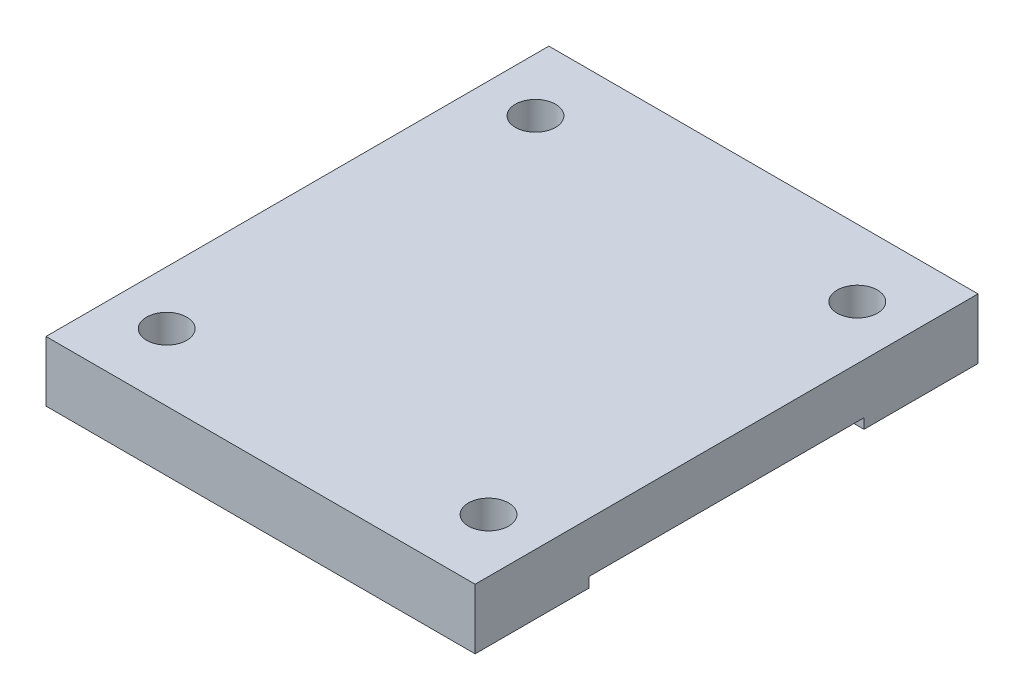
ISO-10303-21;
HEADER;
FILE_DESCRIPTION(('STEP AP214'),'2;1');
FILE_NAME('part.step','',(''),(''),'','','');
FILE_SCHEMA(('AUTOMOTIVE_DESIGN { 1 0 10303 214 1 1 1 1 }'));
ENDSEC;
DATA;
#1=APPLICATION_CONTEXT('core data for automotive mechanical design processes');
#2=APPLICATION_PROTOCOL_DEFINITION('international standard','automotive_design',2000,#1);
#3=PRODUCT_CONTEXT('',#1,'mechanical');
#4=PRODUCT('Part','Part','',(#3));
#5=PRODUCT_RELATED_PRODUCT_CATEGORY('part','',(#4));
#6=PRODUCT_DEFINITION_FORMATION('','',#4);
#7=PRODUCT_DEFINITION_CONTEXT('part definition',#1,'design');
#8=PRODUCT_DEFINITION('design','',#6,#7);
#9=PRODUCT_DEFINITION_SHAPE('','',#8);
#10=(LENGTH_UNIT() NAMED_UNIT(*) SI_UNIT(.MILLI.,.METRE.));
#11=(NAMED_UNIT(*) PLANE_ANGLE_UNIT() SI_UNIT($,.RADIAN.));
#12=(NAMED_UNIT(*) SI_UNIT($,.STERADIAN.) SOLID_ANGLE_UNIT());
#13=UNCERTAINTY_MEASURE_WITH_UNIT(LENGTH_MEASURE(1.E-05),#10,'distance_accuracy_value','');
#14=(GEOMETRIC_REPRESENTATION_CONTEXT(3) GLOBAL_UNCERTAINTY_ASSIGNED_CONTEXT((#13)) GLOBAL_UNIT_ASSIGNED_CONTEXT((#10,
#11,#12)) REPRESENTATION_CONTEXT('',''));
#15=CARTESIAN_POINT('',(0.,0.,0.));
#16=DIRECTION('',(0.,0.,1.));
#17=DIRECTION('',(1.,0.,0.));
#18=AXIS2_PLACEMENT_3D('',#15,#16,#17);
#19=CARTESIAN_POINT('',(0.,0.,37.5));
#20=DIRECTION('',(0.,1.,0.));
#21=DIRECTION('',(0.,0.,1.));
#22=AXIS2_PLACEMENT_3D('',#19,#20,#21);
#23=PLANE('',#22);
#24=CARTESIAN_POINT('',(7.99999999999995,0.,27.5));
#25=DIRECTION('',(0.,1.,0.));
#26=DIRECTION('',(0.,0.,1.));
#27=AXIS2_PLACEMENT_3D('',#24,#25,#26);
#28=CIRCLE('',#27,3.);
#29=CARTESIAN_POINT('',(7.99999999999995,0.,30.5));
#30=VERTEX_POINT('',#29);
#31=EDGE_CURVE('E189',#30,#30,#28,.T.);
#32=ORIENTED_EDGE('',*,*,#31,.T.);
#33=EDGE_LOOP('',(#32));
#34=FACE_BOUND('',#33,.T.);
#35=CARTESIAN_POINT('',(55.9999999999999,0.,27.5));
#36=DIRECTION('',(0.,1.,0.));
#37=DIRECTION('',(0.,0.,1.));
#38=AXIS2_PLACEMENT_3D('',#35,#36,#37);
#39=CIRCLE('',#38,3.);
#40=CARTESIAN_POINT('',(55.9999999999999,0.,30.5));
#41=VERTEX_POINT('',#40);
#42=EDGE_CURVE('E164',#41,#41,#39,.T.);
#43=ORIENTED_EDGE('',*,*,#42,.T.);
#44=EDGE_LOOP('',(#43));
#45=FACE_BOUND('',#44,.T.);
#46=DIRECTION('',(0.,0.,1.));
#47=VECTOR('',#46,1.);
#48=CARTESIAN_POINT('',(0.,0.,-37.5));
#49=LINE('',#48,#47);
#50=CARTESIAN_POINT('',(0.,0.,20.5));
#51=VERTEX_POINT('',#50);
#52=CARTESIAN_POINT('',(0.,0.,37.5));
#53=VERTEX_POINT('',#52);
#54=EDGE_CURVE('E141',#51,#53,#49,.T.);
#55=ORIENTED_EDGE('',*,*,#54,.F.);
#56=DIRECTION('',(-1.,0.,0.));
#57=VECTOR('',#56,1.);
#58=CARTESIAN_POINT('',(0.,0.,20.5));
#59=LINE('',#58,#57);
#60=CARTESIAN_POINT('',(64.,0.,20.5));
#61=VERTEX_POINT('',#60);
#62=EDGE_CURVE('E121',#61,#51,#59,.T.);
#63=ORIENTED_EDGE('',*,*,#62,.F.);
#64=DIRECTION('',(0.,0.,-1.));
#65=VECTOR('',#64,1.);
#66=CARTESIAN_POINT('',(64.,0.,-37.5));
#67=LINE('',#66,#65);
#68=CARTESIAN_POINT('',(64.,0.,37.5));
#69=VERTEX_POINT('',#68);
#70=EDGE_CURVE('E144',#69,#61,#67,.T.);
#71=ORIENTED_EDGE('',*,*,#70,.F.);
#72=DIRECTION('',(1.,0.,0.));
#73=VECTOR('',#72,1.);
#74=CARTESIAN_POINT('',(0.,0.,37.5));
#75=LINE('',#74,#73);
#76=EDGE_CURVE('E140',#53,#69,#75,.T.);
#77=ORIENTED_EDGE('',*,*,#76,.F.);
#78=EDGE_LOOP('',(#55,#63,#71,#77));
#79=FACE_BOUND('',#78,.T.);
#80=ADVANCED_FACE('F32',(#34,#45,#79),#23,.F.);
#81=CARTESIAN_POINT('',(0.,9.,-37.5));
#82=DIRECTION('',(1.,0.,0.));
#83=DIRECTION('',(0.,0.,-1.));
#84=AXIS2_PLACEMENT_3D('',#81,#82,#83);
#85=PLANE('',#84);
#86=DIRECTION('',(0.,0.,-1.));
#87=VECTOR('',#86,1.);
#88=CARTESIAN_POINT('',(0.,1.5,20.5));
#89=LINE('',#88,#87);
#90=CARTESIAN_POINT('',(0.,1.5,20.5));
#91=VERTEX_POINT('',#90);
#92=CARTESIAN_POINT('',(0.,1.5,-20.5));
#93=VERTEX_POINT('',#92);
#94=EDGE_CURVE('E112',#91,#93,#89,.T.);
#95=ORIENTED_EDGE('',*,*,#94,.F.);
#96=DIRECTION('',(0.,-1.,0.));
#97=VECTOR('',#96,1.);
#98=CARTESIAN_POINT('',(0.,1.5,20.5));
#99=LINE('',#98,#97);
#100=EDGE_CURVE('E167',#91,#51,#99,.T.);
#101=ORIENTED_EDGE('',*,*,#100,.T.);
#102=ORIENTED_EDGE('',*,*,#54,.T.);
#103=DIRECTION('',(0.,-1.,0.));
#104=VECTOR('',#103,1.);
#105=CARTESIAN_POINT('',(0.,9.,37.5));
#106=LINE('',#105,#104);
#107=CARTESIAN_POINT('',(0.,9.,37.5));
#108=VERTEX_POINT('',#107);
#109=EDGE_CURVE('E11',#108,#53,#106,.T.);
#110=ORIENTED_EDGE('',*,*,#109,.F.);
#111=DIRECTION('',(0.,0.,1.));
#112=VECTOR('',#111,1.);
#113=CARTESIAN_POINT('',(0.,9.,-37.5));
#114=LINE('',#113,#112);
#115=CARTESIAN_POINT('',(0.,9.,-37.5));
#116=VERTEX_POINT('',#115);
#117=EDGE_CURVE('E132',#116,#108,#114,.T.);
#118=ORIENTED_EDGE('',*,*,#117,.F.);
#119=DIRECTION('',(0.,-1.,0.));
#120=VECTOR('',#119,1.);
#121=CARTESIAN_POINT('',(0.,9.,-37.5));
#122=LINE('',#121,#120);
#123=CARTESIAN_POINT('',(0.,0.,-37.5));
#124=VERTEX_POINT('',#123);
#125=EDGE_CURVE('E138',#116,#124,#122,.T.);
#126=ORIENTED_EDGE('',*,*,#125,.T.);
#127=CARTESIAN_POINT('',(0.,0.,-20.5));
#128=VERTEX_POINT('',#127);
#129=EDGE_CURVE('E125',#124,#128,#49,.T.);
#130=ORIENTED_EDGE('',*,*,#129,.T.);
#131=DIRECTION('',(0.,-1.,0.));
#132=VECTOR('',#131,1.);
#133=CARTESIAN_POINT('',(0.,1.5,-20.5));
#134=LINE('',#133,#132);
#135=EDGE_CURVE('E47',#93,#128,#134,.T.);
#136=ORIENTED_EDGE('',*,*,#135,.F.);
#137=EDGE_LOOP('',(#95,#101,#102,#110,#118,#126,#130,#136));
#138=FACE_BOUND('',#137,.T.);
#139=ADVANCED_FACE('F34',(#138),#85,.F.);
#140=CARTESIAN_POINT('',(0.,9.,37.5));
#141=DIRECTION('',(0.,0.,-1.));
#142=DIRECTION('',(-1.,0.,0.));
#143=AXIS2_PLACEMENT_3D('',#140,#141,#142);
#144=PLANE('',#143);
#145=ORIENTED_EDGE('',*,*,#76,.T.);
#146=DIRECTION('',(0.,-1.,0.));
#147=VECTOR('',#146,1.);
#148=CARTESIAN_POINT('',(64.,9.,37.5));
#149=LINE('',#148,#147);
#150=CARTESIAN_POINT('',(64.,9.,37.5));
#151=VERTEX_POINT('',#150);
#152=EDGE_CURVE('E40',#151,#69,#149,.T.);
#153=ORIENTED_EDGE('',*,*,#152,.F.);
#154=DIRECTION('',(1.,0.,0.));
#155=VECTOR('',#154,1.);
#156=CARTESIAN_POINT('',(0.,9.,37.5));
#157=LINE('',#156,#155);
#158=EDGE_CURVE('E84',#108,#151,#157,.T.);
#159=ORIENTED_EDGE('',*,*,#158,.F.);
#160=ORIENTED_EDGE('',*,*,#109,.T.);
#161=EDGE_LOOP('',(#145,#153,#159,#160));
#162=FACE_BOUND('',#161,.T.);
#163=ADVANCED_FACE('F211',(#162),#144,.F.);
#164=CARTESIAN_POINT('',(64.,9.,-37.5));
#165=DIRECTION('',(-1.,0.,0.));
#166=DIRECTION('',(0.,0.,1.));
#167=AXIS2_PLACEMENT_3D('',#164,#165,#166);
#168=PLANE('',#167);
#169=ORIENTED_EDGE('',*,*,#70,.T.);
#170=DIRECTION('',(0.,-1.,0.));
#171=VECTOR('',#170,1.);
#172=CARTESIAN_POINT('',(64.,1.5,20.5));
#173=LINE('',#172,#171);
#174=CARTESIAN_POINT('',(64.,1.5,20.5));
#175=VERTEX_POINT('',#174);
#176=EDGE_CURVE('E127',#175,#61,#173,.T.);
#177=ORIENTED_EDGE('',*,*,#176,.F.);
#178=DIRECTION('',(0.,0.,1.));
#179=VECTOR('',#178,1.);
#180=CARTESIAN_POINT('',(64.,1.5,20.5));
#181=LINE('',#180,#179);
#182=CARTESIAN_POINT('',(64.,1.5,-20.5));
#183=VERTEX_POINT('',#182);
#184=EDGE_CURVE('E111',#183,#175,#181,.T.);
#185=ORIENTED_EDGE('',*,*,#184,.F.);
#186=DIRECTION('',(0.,-1.,0.));
#187=VECTOR('',#186,1.);
#188=CARTESIAN_POINT('',(64.,1.5,-20.5));
#189=LINE('',#188,#187);
#190=CARTESIAN_POINT('',(64.,0.,-20.5));
#191=VERTEX_POINT('',#190);
#192=EDGE_CURVE('E108',#183,#191,#189,.T.);
#193=ORIENTED_EDGE('',*,*,#192,.T.);
#194=CARTESIAN_POINT('',(64.,0.,-37.5));
#195=VERTEX_POINT('',#194);
#196=EDGE_CURVE('E143',#191,#195,#67,.T.);
#197=ORIENTED_EDGE('',*,*,#196,.T.);
#198=DIRECTION('',(0.,-1.,0.));
#199=VECTOR('',#198,1.);
#200=CARTESIAN_POINT('',(64.,9.,-37.5));
#201=LINE('',#200,#199);
#202=CARTESIAN_POINT('',(64.,9.,-37.5));
#203=VERTEX_POINT('',#202);
#204=EDGE_CURVE('E149',#203,#195,#201,.T.);
#205=ORIENTED_EDGE('',*,*,#204,.F.);
#206=DIRECTION('',(0.,0.,-1.));
#207=VECTOR('',#206,1.);
#208=CARTESIAN_POINT('',(64.,9.,-37.5));
#209=LINE('',#208,#207);
#210=EDGE_CURVE('E135',#151,#203,#209,.T.);
#211=ORIENTED_EDGE('',*,*,#210,.F.);
#212=ORIENTED_EDGE('',*,*,#152,.T.);
#213=EDGE_LOOP('',(#169,#177,#185,#193,#197,#205,#211,#212));
#214=FACE_BOUND('',#213,.T.);
#215=ADVANCED_FACE('F154',(#214),#168,.F.);
#216=CARTESIAN_POINT('',(0.,9.,-37.5));
#217=DIRECTION('',(0.,0.,1.));
#218=DIRECTION('',(1.,0.,0.));
#219=AXIS2_PLACEMENT_3D('',#216,#217,#218);
#220=PLANE('',#219);
#221=DIRECTION('',(-1.,0.,0.));
#222=VECTOR('',#221,1.);
#223=CARTESIAN_POINT('',(0.,0.,-37.5));
#224=LINE('',#223,#222);
#225=EDGE_CURVE('E77',#195,#124,#224,.T.);
#226=ORIENTED_EDGE('',*,*,#225,.T.);
#227=ORIENTED_EDGE('',*,*,#125,.F.);
#228=DIRECTION('',(-1.,0.,0.));
#229=VECTOR('',#228,1.);
#230=CARTESIAN_POINT('',(0.,9.,-37.5));
#231=LINE('',#230,#229);
#232=EDGE_CURVE('E56',#203,#116,#231,.T.);
#233=ORIENTED_EDGE('',*,*,#232,.F.);
#234=ORIENTED_EDGE('',*,*,#204,.T.);
#235=EDGE_LOOP('',(#226,#227,#233,#234));
#236=FACE_BOUND('',#235,.T.);
#237=ADVANCED_FACE('F202',(#236),#220,.F.);
#238=CARTESIAN_POINT('',(0.,9.,37.5));
#239=DIRECTION('',(0.,1.,0.));
#240=DIRECTION('',(0.,0.,1.));
#241=AXIS2_PLACEMENT_3D('',#238,#239,#240);
#242=PLANE('',#241);
#243=CARTESIAN_POINT('',(7.99999999999995,9.,27.5));
#244=DIRECTION('',(0.,1.,0.));
#245=DIRECTION('',(0.,0.,1.));
#246=AXIS2_PLACEMENT_3D('',#243,#244,#245);
#247=CIRCLE('',#246,2.99999999999999);
#248=CARTESIAN_POINT('',(7.99999999999995,9.,30.5));
#249=VERTEX_POINT('',#248);
#250=EDGE_CURVE('E192',#249,#249,#247,.T.);
#251=ORIENTED_EDGE('',*,*,#250,.F.);
#252=EDGE_LOOP('',(#251));
#253=FACE_BOUND('',#252,.T.);
#254=CARTESIAN_POINT('',(7.99999999999995,9.,-27.5));
#255=DIRECTION('',(0.,1.,0.));
#256=DIRECTION('',(0.,0.,1.));
#257=AXIS2_PLACEMENT_3D('',#254,#255,#256);
#258=CIRCLE('',#257,2.99999999999999);
#259=CARTESIAN_POINT('',(7.99999999999995,9.,-24.5));
#260=VERTEX_POINT('',#259);
#261=EDGE_CURVE('E186',#260,#260,#258,.T.);
#262=ORIENTED_EDGE('',*,*,#261,.F.);
#263=EDGE_LOOP('',(#262));
#264=FACE_BOUND('',#263,.T.);
#265=CARTESIAN_POINT('',(55.9999999999999,9.,-27.5));
#266=DIRECTION('',(0.,1.,0.));
#267=DIRECTION('',(0.,0.,1.));
#268=AXIS2_PLACEMENT_3D('',#265,#266,#267);
#269=CIRCLE('',#268,2.99999999999999);
#270=CARTESIAN_POINT('',(55.9999999999999,9.,-24.5000000000001));
#271=VERTEX_POINT('',#270);
#272=EDGE_CURVE('E180',#271,#271,#269,.T.);
#273=ORIENTED_EDGE('',*,*,#272,.F.);
#274=EDGE_LOOP('',(#273));
#275=FACE_BOUND('',#274,.T.);
#276=CARTESIAN_POINT('',(55.9999999999999,9.,27.5));
#277=DIRECTION('',(0.,1.,0.));
#278=DIRECTION('',(0.,0.,1.));
#279=AXIS2_PLACEMENT_3D('',#276,#277,#278);
#280=CIRCLE('',#279,2.99999999999999);
#281=CARTESIAN_POINT('',(55.9999999999999,9.,30.5));
#282=VERTEX_POINT('',#281);
#283=EDGE_CURVE('E174',#282,#282,#280,.T.);
#284=ORIENTED_EDGE('',*,*,#283,.F.);
#285=EDGE_LOOP('',(#284));
#286=FACE_BOUND('',#285,.T.);
#287=ORIENTED_EDGE('',*,*,#117,.T.);
#288=ORIENTED_EDGE('',*,*,#158,.T.);
#289=ORIENTED_EDGE('',*,*,#210,.T.);
#290=ORIENTED_EDGE('',*,*,#232,.T.);
#291=EDGE_LOOP('',(#287,#288,#289,#290));
#292=FACE_BOUND('',#291,.T.);
#293=ADVANCED_FACE('F198',(#253,#264,#275,#286,#292),#242,.T.);
#294=CARTESIAN_POINT('',(7.99999999999995,0.,-27.5));
#295=DIRECTION('',(0.,1.,0.));
#296=DIRECTION('',(0.,0.,1.));
#297=AXIS2_PLACEMENT_3D('',#294,#295,#296);
#298=CIRCLE('',#297,3.);
#299=CARTESIAN_POINT('',(7.99999999999995,0.,-24.5));
#300=VERTEX_POINT('',#299);
#301=EDGE_CURVE('E183',#300,#300,#298,.T.);
#302=ORIENTED_EDGE('',*,*,#301,.T.);
#303=EDGE_LOOP('',(#302));
#304=FACE_BOUND('',#303,.T.);
#305=CARTESIAN_POINT('',(55.9999999999999,0.,-27.5));
#306=DIRECTION('',(0.,1.,0.));
#307=DIRECTION('',(0.,0.,1.));
#308=AXIS2_PLACEMENT_3D('',#305,#306,#307);
#309=CIRCLE('',#308,3.);
#310=CARTESIAN_POINT('',(55.9999999999999,0.,-24.5));
#311=VERTEX_POINT('',#310);
#312=EDGE_CURVE('E177',#311,#311,#309,.T.);
#313=ORIENTED_EDGE('',*,*,#312,.T.);
#314=EDGE_LOOP('',(#313));
#315=FACE_BOUND('',#314,.T.);
#316=ORIENTED_EDGE('',*,*,#196,.F.);
#317=DIRECTION('',(1.,0.,0.));
#318=VECTOR('',#317,1.);
#319=CARTESIAN_POINT('',(0.,0.,-20.5));
#320=LINE('',#319,#318);
#321=EDGE_CURVE('E162',#128,#191,#320,.T.);
#322=ORIENTED_EDGE('',*,*,#321,.F.);
#323=ORIENTED_EDGE('',*,*,#129,.F.);
#324=ORIENTED_EDGE('',*,*,#225,.F.);
#325=EDGE_LOOP('',(#316,#322,#323,#324));
#326=FACE_BOUND('',#325,.T.);
#327=ADVANCED_FACE('F201',(#304,#315,#326),#23,.F.);
#328=CARTESIAN_POINT('',(0.,1.5,20.5));
#329=DIRECTION('',(0.,0.,1.));
#330=DIRECTION('',(1.,0.,0.));
#331=AXIS2_PLACEMENT_3D('',#328,#329,#330);
#332=PLANE('',#331);
#333=ORIENTED_EDGE('',*,*,#62,.T.);
#334=ORIENTED_EDGE('',*,*,#100,.F.);
#335=DIRECTION('',(-1.,0.,0.));
#336=VECTOR('',#335,1.);
#337=CARTESIAN_POINT('',(0.,1.5,20.5));
#338=LINE('',#337,#336);
#339=EDGE_CURVE('E118',#175,#91,#338,.T.);
#340=ORIENTED_EDGE('',*,*,#339,.F.);
#341=ORIENTED_EDGE('',*,*,#176,.T.);
#342=EDGE_LOOP('',(#333,#334,#340,#341));
#343=FACE_BOUND('',#342,.T.);
#344=ADVANCED_FACE('F168',(#343),#332,.F.);
#345=CARTESIAN_POINT('',(0.,1.5,-20.5));
#346=DIRECTION('',(0.,0.,-1.));
#347=DIRECTION('',(-1.,0.,0.));
#348=AXIS2_PLACEMENT_3D('',#345,#346,#347);
#349=PLANE('',#348);
#350=ORIENTED_EDGE('',*,*,#321,.T.);
#351=ORIENTED_EDGE('',*,*,#192,.F.);
#352=DIRECTION('',(1.,0.,0.));
#353=VECTOR('',#352,1.);
#354=CARTESIAN_POINT('',(0.,1.5,-20.5));
#355=LINE('',#354,#353);
#356=EDGE_CURVE('E104',#93,#183,#355,.T.);
#357=ORIENTED_EDGE('',*,*,#356,.F.);
#358=ORIENTED_EDGE('',*,*,#135,.T.);
#359=EDGE_LOOP('',(#350,#351,#357,#358));
#360=FACE_BOUND('',#359,.T.);
#361=ADVANCED_FACE('F106',(#360),#349,.F.);
#362=CARTESIAN_POINT('',(0.,1.5,-20.5));
#363=DIRECTION('',(0.,-1.,0.));
#364=DIRECTION('',(0.,0.,-1.));
#365=AXIS2_PLACEMENT_3D('',#362,#363,#364);
#366=PLANE('',#365);
#367=ORIENTED_EDGE('',*,*,#94,.T.);
#368=ORIENTED_EDGE('',*,*,#356,.T.);
#369=ORIENTED_EDGE('',*,*,#184,.T.);
#370=ORIENTED_EDGE('',*,*,#339,.T.);
#371=EDGE_LOOP('',(#367,#368,#369,#370));
#372=FACE_BOUND('',#371,.T.);
#373=ADVANCED_FACE('F116',(#372),#366,.T.);
#374=CARTESIAN_POINT('',(55.9999999999999,9.,27.5));
#375=DIRECTION('',(0.,1.,0.));
#376=DIRECTION('',(0.,0.,1.));
#377=AXIS2_PLACEMENT_3D('',#374,#375,#376);
#378=CYLINDRICAL_SURFACE('',#377,2.99999999999999);
#379=ORIENTED_EDGE('',*,*,#42,.F.);
#380=EDGE_LOOP('',(#379));
#381=FACE_BOUND('',#380,.T.);
#382=ORIENTED_EDGE('',*,*,#283,.T.);
#383=EDGE_LOOP('',(#382));
#384=FACE_BOUND('',#383,.T.);
#385=ADVANCED_FACE('F257',(#381,#384),#378,.F.);
#386=CARTESIAN_POINT('',(55.9999999999999,9.,-27.5));
#387=DIRECTION('',(0.,1.,0.));
#388=DIRECTION('',(0.,0.,1.));
#389=AXIS2_PLACEMENT_3D('',#386,#387,#388);
#390=CYLINDRICAL_SURFACE('',#389,2.99999999999999);
#391=ORIENTED_EDGE('',*,*,#312,.F.);
#392=EDGE_LOOP('',(#391));
#393=FACE_BOUND('',#392,.T.);
#394=ORIENTED_EDGE('',*,*,#272,.T.);
#395=EDGE_LOOP('',(#394));
#396=FACE_BOUND('',#395,.T.);
#397=ADVANCED_FACE('F262',(#393,#396),#390,.F.);
#398=CARTESIAN_POINT('',(7.99999999999995,9.,-27.5));
#399=DIRECTION('',(0.,1.,0.));
#400=DIRECTION('',(0.,0.,1.));
#401=AXIS2_PLACEMENT_3D('',#398,#399,#400);
#402=CYLINDRICAL_SURFACE('',#401,2.99999999999999);
#403=ORIENTED_EDGE('',*,*,#301,.F.);
#404=EDGE_LOOP('',(#403));
#405=FACE_BOUND('',#404,.T.);
#406=ORIENTED_EDGE('',*,*,#261,.T.);
#407=EDGE_LOOP('',(#406));
#408=FACE_BOUND('',#407,.T.);
#409=ADVANCED_FACE('F274',(#405,#408),#402,.F.);
#410=CARTESIAN_POINT('',(7.99999999999995,9.,27.5));
#411=DIRECTION('',(0.,1.,0.));
#412=DIRECTION('',(0.,0.,1.));
#413=AXIS2_PLACEMENT_3D('',#410,#411,#412);
#414=CYLINDRICAL_SURFACE('',#413,2.99999999999999);
#415=ORIENTED_EDGE('',*,*,#31,.F.);
#416=EDGE_LOOP('',(#415));
#417=FACE_BOUND('',#416,.T.);
#418=ORIENTED_EDGE('',*,*,#250,.T.);
#419=EDGE_LOOP('',(#418));
#420=FACE_BOUND('',#419,.T.);
#421=ADVANCED_FACE('F196',(#417,#420),#414,.F.);
#422=CLOSED_SHELL('',(#80,#139,#163,#215,#237,#293,#327,#344,#361,#373,#385,#397,#409,#421));
#423=MANIFOLD_SOLID_BREP('B2',#422);
#424=ADVANCED_BREP_SHAPE_REPRESENTATION('',(#18,#423),#14);
#425=SHAPE_DEFINITION_REPRESENTATION(#9,#424);
ENDSEC;
END-ISO-10303-21;
